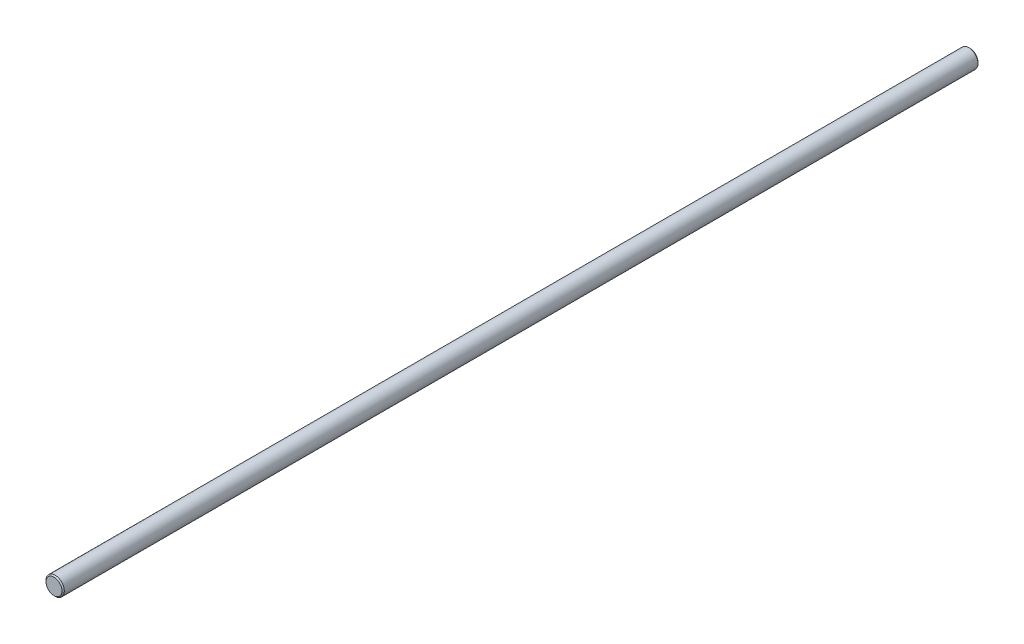
ISO-10303-21;
HEADER;
FILE_DESCRIPTION(('STEP AP214'),'2;1');
FILE_NAME('part.step','',(''),(''),'','','');
FILE_SCHEMA(('AUTOMOTIVE_DESIGN { 1 0 10303 214 1 1 1 1 }'));
ENDSEC;
DATA;
#1=APPLICATION_CONTEXT('core data for automotive mechanical design processes');
#2=APPLICATION_PROTOCOL_DEFINITION('international standard','automotive_design',2000,#1);
#3=PRODUCT_CONTEXT('',#1,'mechanical');
#4=PRODUCT('Part','Part','',(#3));
#5=PRODUCT_RELATED_PRODUCT_CATEGORY('part','',(#4));
#6=PRODUCT_DEFINITION_FORMATION('','',#4);
#7=PRODUCT_DEFINITION_CONTEXT('part definition',#1,'design');
#8=PRODUCT_DEFINITION('design','',#6,#7);
#9=PRODUCT_DEFINITION_SHAPE('','',#8);
#10=(LENGTH_UNIT() NAMED_UNIT(*) SI_UNIT(.MILLI.,.METRE.));
#11=(NAMED_UNIT(*) PLANE_ANGLE_UNIT() SI_UNIT($,.RADIAN.));
#12=(NAMED_UNIT(*) SI_UNIT($,.STERADIAN.) SOLID_ANGLE_UNIT());
#13=UNCERTAINTY_MEASURE_WITH_UNIT(LENGTH_MEASURE(1.E-05),#10,'distance_accuracy_value','');
#14=(GEOMETRIC_REPRESENTATION_CONTEXT(3) GLOBAL_UNCERTAINTY_ASSIGNED_CONTEXT((#13)) GLOBAL_UNIT_ASSIGNED_CONTEXT((#10,
#11,#12)) REPRESENTATION_CONTEXT('',''));
#15=CARTESIAN_POINT('',(0.,0.,0.));
#16=DIRECTION('',(0.,0.,1.));
#17=DIRECTION('',(1.,0.,0.));
#18=AXIS2_PLACEMENT_3D('',#15,#16,#17);
#19=CARTESIAN_POINT('',(0.,0.,300.));
#20=DIRECTION('',(0.,0.,-1.));
#21=DIRECTION('',(-1.,0.,0.));
#22=AXIS2_PLACEMENT_3D('',#19,#20,#21);
#23=CYLINDRICAL_SURFACE('',#22,6.);
#24=CARTESIAN_POINT('',(0.,0.,-299.25));
#25=DIRECTION('',(0.,0.,1.));
#26=DIRECTION('',(1.,0.,0.));
#27=AXIS2_PLACEMENT_3D('',#24,#25,#26);
#28=CIRCLE('',#27,6.);
#29=CARTESIAN_POINT('',(6.,0.,-299.25));
#30=VERTEX_POINT('',#29);
#31=EDGE_CURVE('E55',#30,#30,#28,.T.);
#32=ORIENTED_EDGE('',*,*,#31,.T.);
#33=EDGE_LOOP('',(#32));
#34=FACE_BOUND('',#33,.T.);
#35=CARTESIAN_POINT('',(0.,0.,299.25));
#36=DIRECTION('',(0.,0.,1.));
#37=DIRECTION('',(1.,0.,0.));
#38=AXIS2_PLACEMENT_3D('',#35,#36,#37);
#39=CIRCLE('',#38,6.);
#40=CARTESIAN_POINT('',(6.,0.,299.25));
#41=VERTEX_POINT('',#40);
#42=EDGE_CURVE('E59',#41,#41,#39,.F.);
#43=ORIENTED_EDGE('',*,*,#42,.T.);
#44=EDGE_LOOP('',(#43));
#45=FACE_BOUND('',#44,.T.);
#46=ADVANCED_FACE('F43',(#34,#45),#23,.T.);
#47=CARTESIAN_POINT('',(0.,0.,300.));
#48=DIRECTION('',(0.,0.,1.));
#49=DIRECTION('',(1.,0.,0.));
#50=AXIS2_PLACEMENT_3D('',#47,#48,#49);
#51=PLANE('',#50);
#52=CARTESIAN_POINT('',(0.,0.,300.));
#53=DIRECTION('',(0.,0.,1.));
#54=DIRECTION('',(1.,0.,0.));
#55=AXIS2_PLACEMENT_3D('',#52,#53,#54);
#56=CIRCLE('',#55,5.25000000000003);
#57=CARTESIAN_POINT('',(5.25000000000003,0.,300.));
#58=VERTEX_POINT('',#57);
#59=EDGE_CURVE('E10',#58,#58,#56,.T.);
#60=ORIENTED_EDGE('',*,*,#59,.T.);
#61=EDGE_LOOP('',(#60));
#62=FACE_BOUND('',#61,.T.);
#63=ADVANCED_FACE('F75',(#62),#51,.T.);
#64=CARTESIAN_POINT('',(0.,0.,-300.));
#65=DIRECTION('',(0.,0.,1.));
#66=DIRECTION('',(1.,0.,0.));
#67=AXIS2_PLACEMENT_3D('',#64,#65,#66);
#68=PLANE('',#67);
#69=CARTESIAN_POINT('',(0.,0.,-300.));
#70=DIRECTION('',(0.,0.,1.));
#71=DIRECTION('',(1.,0.,0.));
#72=AXIS2_PLACEMENT_3D('',#69,#70,#71);
#73=CIRCLE('',#72,5.25000000000003);
#74=CARTESIAN_POINT('',(5.25000000000003,0.,-300.));
#75=VERTEX_POINT('',#74);
#76=EDGE_CURVE('E51',#75,#75,#73,.F.);
#77=ORIENTED_EDGE('',*,*,#76,.T.);
#78=EDGE_LOOP('',(#77));
#79=FACE_BOUND('',#78,.T.);
#80=ADVANCED_FACE('F72',(#79),#68,.F.);
#81=CARTESIAN_POINT('',(0.,0.,-299.25));
#82=DIRECTION('',(0.,0.,1.));
#83=DIRECTION('',(1.,0.,0.));
#84=AXIS2_PLACEMENT_3D('',#81,#82,#83);
#85=CONICAL_SURFACE('',#84,6.,0.785398163397482);
#86=ORIENTED_EDGE('',*,*,#76,.F.);
#87=EDGE_LOOP('',(#86));
#88=FACE_BOUND('',#87,.T.);
#89=ORIENTED_EDGE('',*,*,#31,.F.);
#90=EDGE_LOOP('',(#89));
#91=FACE_BOUND('',#90,.T.);
#92=ADVANCED_FACE('F68',(#88,#91),#85,.T.);
#93=CARTESIAN_POINT('',(0.,0.,300.));
#94=DIRECTION('',(0.,0.,-1.));
#95=DIRECTION('',(-1.,0.,0.));
#96=AXIS2_PLACEMENT_3D('',#93,#94,#95);
#97=CONICAL_SURFACE('',#96,5.25000000000003,0.785398163397445);
#98=ORIENTED_EDGE('',*,*,#42,.F.);
#99=EDGE_LOOP('',(#98));
#100=FACE_BOUND('',#99,.T.);
#101=ORIENTED_EDGE('',*,*,#59,.F.);
#102=EDGE_LOOP('',(#101));
#103=FACE_BOUND('',#102,.T.);
#104=ADVANCED_FACE('F46',(#100,#103),#97,.T.);
#105=CLOSED_SHELL('',(#46,#63,#80,#92,#104));
#106=MANIFOLD_SOLID_BREP('B2',#105);
#107=ADVANCED_BREP_SHAPE_REPRESENTATION('',(#18,#106),#14);
#108=SHAPE_DEFINITION_REPRESENTATION(#9,#107);
ENDSEC;
END-ISO-10303-21;
